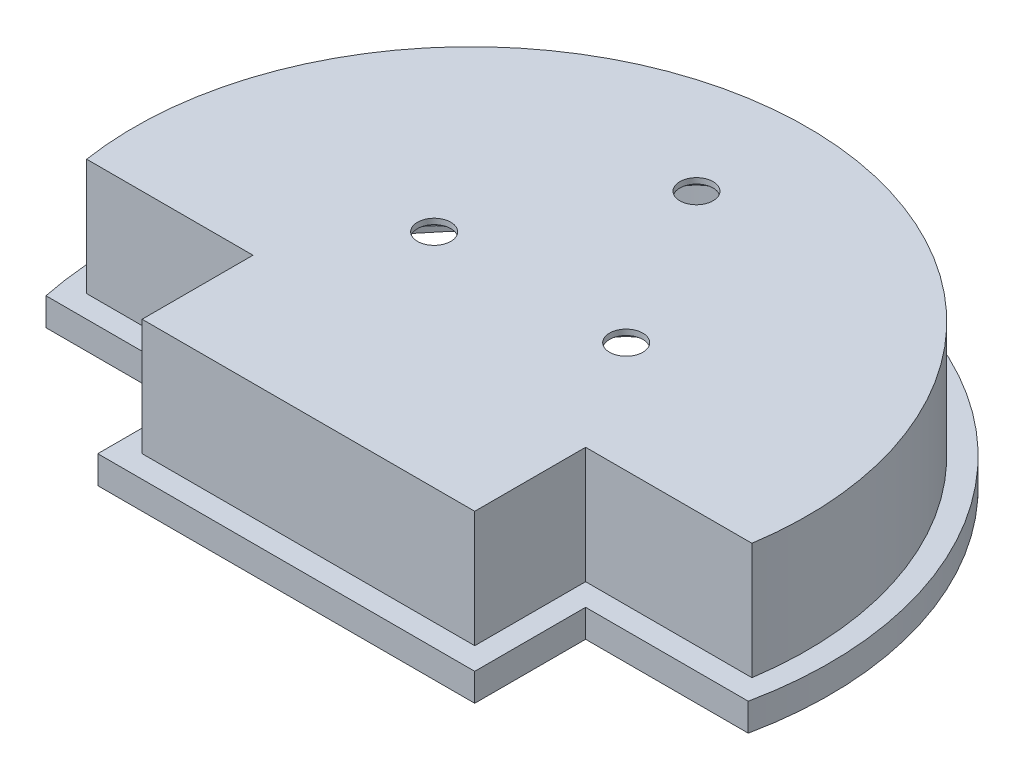
ISO-10303-21;
HEADER;
FILE_DESCRIPTION(('STEP AP214'),'2;1');
FILE_NAME('part.step','',(''),(''),'','','');
FILE_SCHEMA(('AUTOMOTIVE_DESIGN { 1 0 10303 214 1 1 1 1 }'));
ENDSEC;
DATA;
#1=APPLICATION_CONTEXT('core data for automotive mechanical design processes');
#2=APPLICATION_PROTOCOL_DEFINITION('international standard','automotive_design',2000,#1);
#3=PRODUCT_CONTEXT('',#1,'mechanical');
#4=PRODUCT('Part','Part','',(#3));
#5=PRODUCT_RELATED_PRODUCT_CATEGORY('part','',(#4));
#6=PRODUCT_DEFINITION_FORMATION('','',#4);
#7=PRODUCT_DEFINITION_CONTEXT('part definition',#1,'design');
#8=PRODUCT_DEFINITION('design','',#6,#7);
#9=PRODUCT_DEFINITION_SHAPE('','',#8);
#10=(LENGTH_UNIT() NAMED_UNIT(*) SI_UNIT(.MILLI.,.METRE.));
#11=(NAMED_UNIT(*) PLANE_ANGLE_UNIT() SI_UNIT($,.RADIAN.));
#12=(NAMED_UNIT(*) SI_UNIT($,.STERADIAN.) SOLID_ANGLE_UNIT());
#13=UNCERTAINTY_MEASURE_WITH_UNIT(LENGTH_MEASURE(1.E-05),#10,'distance_accuracy_value','');
#14=(GEOMETRIC_REPRESENTATION_CONTEXT(3) GLOBAL_UNCERTAINTY_ASSIGNED_CONTEXT((#13)) GLOBAL_UNIT_ASSIGNED_CONTEXT((#10,
#11,#12)) REPRESENTATION_CONTEXT('',''));
#15=CARTESIAN_POINT('',(0.,0.,0.));
#16=DIRECTION('',(0.,0.,1.));
#17=DIRECTION('',(1.,0.,0.));
#18=AXIS2_PLACEMENT_3D('',#15,#16,#17);
#19=CARTESIAN_POINT('',(0.,0.,-14.6428571428571));
#20=DIRECTION('',(0.,1.,0.));
#21=DIRECTION('',(0.,0.,1.));
#22=AXIS2_PLACEMENT_3D('',#19,#20,#21);
#23=PLANE('',#22);
#24=DIRECTION('',(0.,0.,1.));
#25=VECTOR('',#24,1.);
#26=CARTESIAN_POINT('',(-13.,0.,-14.6428571428571));
#27=LINE('',#26,#25);
#28=CARTESIAN_POINT('',(-13.,0.,-12.));
#29=VERTEX_POINT('',#28);
#30=CARTESIAN_POINT('',(-13.,0.,-2.));
#31=VERTEX_POINT('',#30);
#32=EDGE_CURVE('E356',#29,#31,#27,.T.);
#33=ORIENTED_EDGE('',*,*,#32,.T.);
#34=DIRECTION('',(1.,0.,0.));
#35=VECTOR('',#34,1.);
#36=CARTESIAN_POINT('',(0.,0.,-2.));
#37=LINE('',#36,#35);
#38=CARTESIAN_POINT('',(13.,0.,-2.));
#39=VERTEX_POINT('',#38);
#40=EDGE_CURVE('E386',#31,#39,#37,.T.);
#41=ORIENTED_EDGE('',*,*,#40,.T.);
#42=DIRECTION('',(0.,0.,-1.));
#43=VECTOR('',#42,1.);
#44=CARTESIAN_POINT('',(13.,0.,-14.6428571428571));
#45=LINE('',#44,#43);
#46=CARTESIAN_POINT('',(13.,0.,-12.));
#47=VERTEX_POINT('',#46);
#48=EDGE_CURVE('E390',#39,#47,#45,.T.);
#49=ORIENTED_EDGE('',*,*,#48,.T.);
#50=DIRECTION('',(1.,0.,0.));
#51=VECTOR('',#50,1.);
#52=CARTESIAN_POINT('',(0.,0.,-12.));
#53=LINE('',#52,#51);
#54=CARTESIAN_POINT('',(28.2337184434296,0.,-12.));
#55=VERTEX_POINT('',#54);
#56=EDGE_CURVE('E394',#47,#55,#53,.T.);
#57=ORIENTED_EDGE('',*,*,#56,.T.);
#58=CARTESIAN_POINT('',(0.,0.,-14.6428571428571));
#59=DIRECTION('',(0.,-1.,0.));
#60=DIRECTION('',(-1.,0.,0.));
#61=AXIS2_PLACEMENT_3D('',#58,#59,#60);
#62=CIRCLE('',#61,28.3571428571429);
#63=CARTESIAN_POINT('',(-28.2337184434296,0.,-12.));
#64=VERTEX_POINT('',#63);
#65=EDGE_CURVE('E398',#55,#64,#62,.F.);
#66=ORIENTED_EDGE('',*,*,#65,.T.);
#67=DIRECTION('',(1.,0.,0.));
#68=VECTOR('',#67,1.);
#69=CARTESIAN_POINT('',(0.,0.,-12.));
#70=LINE('',#69,#68);
#71=EDGE_CURVE('E362',#64,#29,#70,.T.);
#72=ORIENTED_EDGE('',*,*,#71,.T.);
#73=EDGE_LOOP('',(#33,#41,#49,#57,#66,#72));
#74=FACE_BOUND('',#73,.T.);
#75=DIRECTION('',(0.,0.,1.));
#76=VECTOR('',#75,1.);
#77=CARTESIAN_POINT('',(17.,0.,-8.00000000000001));
#78=LINE('',#77,#76);
#79=CARTESIAN_POINT('',(17.,0.,-8.00000000000001));
#80=VERTEX_POINT('',#79);
#81=CARTESIAN_POINT('',(17.,0.,2.));
#82=VERTEX_POINT('',#81);
#83=EDGE_CURVE('E259',#80,#82,#78,.T.);
#84=ORIENTED_EDGE('',*,*,#83,.T.);
#85=DIRECTION('',(-1.,0.,0.));
#86=VECTOR('',#85,1.);
#87=CARTESIAN_POINT('',(17.,0.,2.));
#88=LINE('',#87,#86);
#89=CARTESIAN_POINT('',(-17.,0.,2.));
#90=VERTEX_POINT('',#89);
#91=EDGE_CURVE('E212',#82,#90,#88,.T.);
#92=ORIENTED_EDGE('',*,*,#91,.T.);
#93=DIRECTION('',(0.,0.,-1.));
#94=VECTOR('',#93,1.);
#95=CARTESIAN_POINT('',(-17.,0.,2.));
#96=LINE('',#95,#94);
#97=CARTESIAN_POINT('',(-17.,0.,-8.));
#98=VERTEX_POINT('',#97);
#99=EDGE_CURVE('E264',#90,#98,#96,.T.);
#100=ORIENTED_EDGE('',*,*,#99,.T.);
#101=DIRECTION('',(-1.,0.,0.));
#102=VECTOR('',#101,1.);
#103=CARTESIAN_POINT('',(-17.,0.,-8.));
#104=LINE('',#103,#102);
#105=CARTESIAN_POINT('',(-31.6679197747049,0.,-8.));
#106=VERTEX_POINT('',#105);
#107=EDGE_CURVE('E268',#98,#106,#104,.T.);
#108=ORIENTED_EDGE('',*,*,#107,.T.);
#109=CARTESIAN_POINT('',(0.,0.,-14.6428571428571));
#110=DIRECTION('',(0.,-1.,0.));
#111=DIRECTION('',(0.,0.,-1.));
#112=AXIS2_PLACEMENT_3D('',#109,#110,#111);
#113=CIRCLE('',#112,32.3571428571429);
#114=CARTESIAN_POINT('',(31.6679197747049,0.,-8.00000000000001));
#115=VERTEX_POINT('',#114);
#116=EDGE_CURVE('E241',#106,#115,#113,.T.);
#117=ORIENTED_EDGE('',*,*,#116,.T.);
#118=DIRECTION('',(-1.,0.,0.));
#119=VECTOR('',#118,1.);
#120=CARTESIAN_POINT('',(31.6679197747049,0.,-8.00000000000001));
#121=LINE('',#120,#119);
#122=EDGE_CURVE('E237',#115,#80,#121,.T.);
#123=ORIENTED_EDGE('',*,*,#122,.T.);
#124=EDGE_LOOP('',(#84,#92,#100,#108,#117,#123));
#125=FACE_BOUND('',#124,.T.);
#126=ADVANCED_FACE('F79',(#74,#125),#23,.F.);
#127=CARTESIAN_POINT('',(-13.,11.,-14.6428571428571));
#128=DIRECTION('',(1.,0.,0.));
#129=DIRECTION('',(0.,0.,-1.));
#130=AXIS2_PLACEMENT_3D('',#127,#128,#129);
#131=PLANE('',#130);
#132=ORIENTED_EDGE('',*,*,#32,.F.);
#133=DIRECTION('',(0.,-1.,0.));
#134=VECTOR('',#133,1.);
#135=CARTESIAN_POINT('',(-13.,11.,-12.));
#136=LINE('',#135,#134);
#137=CARTESIAN_POINT('',(-13.,11.,-12.));
#138=VERTEX_POINT('',#137);
#139=EDGE_CURVE('E382',#138,#29,#136,.T.);
#140=ORIENTED_EDGE('',*,*,#139,.F.);
#141=DIRECTION('',(0.,0.,1.));
#142=VECTOR('',#141,1.);
#143=CARTESIAN_POINT('',(-13.,11.,-14.6428571428571));
#144=LINE('',#143,#142);
#145=CARTESIAN_POINT('',(-13.,11.,-2.));
#146=VERTEX_POINT('',#145);
#147=EDGE_CURVE('E357',#138,#146,#144,.T.);
#148=ORIENTED_EDGE('',*,*,#147,.T.);
#149=DIRECTION('',(0.,-1.,0.));
#150=VECTOR('',#149,1.);
#151=CARTESIAN_POINT('',(-13.,11.,-2.));
#152=LINE('',#151,#150);
#153=EDGE_CURVE('E419',#146,#31,#152,.T.);
#154=ORIENTED_EDGE('',*,*,#153,.T.);
#155=EDGE_LOOP('',(#132,#140,#148,#154));
#156=FACE_BOUND('',#155,.T.);
#157=ADVANCED_FACE('F483',(#156),#131,.T.);
#158=CARTESIAN_POINT('',(0.,11.,-2.));
#159=DIRECTION('',(0.,0.,-1.));
#160=DIRECTION('',(-1.,0.,0.));
#161=AXIS2_PLACEMENT_3D('',#158,#159,#160);
#162=PLANE('',#161);
#163=ORIENTED_EDGE('',*,*,#40,.F.);
#164=ORIENTED_EDGE('',*,*,#153,.F.);
#165=DIRECTION('',(1.,0.,0.));
#166=VECTOR('',#165,1.);
#167=CARTESIAN_POINT('',(0.,11.,-2.));
#168=LINE('',#167,#166);
#169=CARTESIAN_POINT('',(13.,11.,-2.));
#170=VERTEX_POINT('',#169);
#171=EDGE_CURVE('E361',#146,#170,#168,.T.);
#172=ORIENTED_EDGE('',*,*,#171,.T.);
#173=DIRECTION('',(0.,-1.,0.));
#174=VECTOR('',#173,1.);
#175=CARTESIAN_POINT('',(13.,11.,-2.));
#176=LINE('',#175,#174);
#177=EDGE_CURVE('E416',#170,#39,#176,.T.);
#178=ORIENTED_EDGE('',*,*,#177,.T.);
#179=EDGE_LOOP('',(#163,#164,#172,#178));
#180=FACE_BOUND('',#179,.T.);
#181=ADVANCED_FACE('F485',(#180),#162,.T.);
#182=CARTESIAN_POINT('',(13.,11.,-14.6428571428571));
#183=DIRECTION('',(-1.,0.,0.));
#184=DIRECTION('',(0.,0.,1.));
#185=AXIS2_PLACEMENT_3D('',#182,#183,#184);
#186=PLANE('',#185);
#187=ORIENTED_EDGE('',*,*,#48,.F.);
#188=ORIENTED_EDGE('',*,*,#177,.F.);
#189=DIRECTION('',(0.,0.,-1.));
#190=VECTOR('',#189,1.);
#191=CARTESIAN_POINT('',(13.,11.,-14.6428571428571));
#192=LINE('',#191,#190);
#193=CARTESIAN_POINT('',(13.,11.,-12.));
#194=VERTEX_POINT('',#193);
#195=EDGE_CURVE('E366',#170,#194,#192,.T.);
#196=ORIENTED_EDGE('',*,*,#195,.T.);
#197=DIRECTION('',(0.,-1.,0.));
#198=VECTOR('',#197,1.);
#199=CARTESIAN_POINT('',(13.,11.,-12.));
#200=LINE('',#199,#198);
#201=EDGE_CURVE('E413',#194,#47,#200,.T.);
#202=ORIENTED_EDGE('',*,*,#201,.T.);
#203=EDGE_LOOP('',(#187,#188,#196,#202));
#204=FACE_BOUND('',#203,.T.);
#205=ADVANCED_FACE('F501',(#204),#186,.T.);
#206=CARTESIAN_POINT('',(0.,11.,-12.));
#207=DIRECTION('',(0.,0.,-1.));
#208=DIRECTION('',(-1.,0.,0.));
#209=AXIS2_PLACEMENT_3D('',#206,#207,#208);
#210=PLANE('',#209);
#211=ORIENTED_EDGE('',*,*,#56,.F.);
#212=ORIENTED_EDGE('',*,*,#201,.F.);
#213=DIRECTION('',(1.,0.,0.));
#214=VECTOR('',#213,1.);
#215=CARTESIAN_POINT('',(0.,11.,-12.));
#216=LINE('',#215,#214);
#217=CARTESIAN_POINT('',(28.2337184434296,11.,-12.));
#218=VERTEX_POINT('',#217);
#219=EDGE_CURVE('E370',#194,#218,#216,.T.);
#220=ORIENTED_EDGE('',*,*,#219,.T.);
#221=DIRECTION('',(0.,-1.,0.));
#222=VECTOR('',#221,1.);
#223=CARTESIAN_POINT('',(28.2337184434296,11.,-12.));
#224=LINE('',#223,#222);
#225=EDGE_CURVE('E410',#218,#55,#224,.T.);
#226=ORIENTED_EDGE('',*,*,#225,.T.);
#227=EDGE_LOOP('',(#211,#212,#220,#226));
#228=FACE_BOUND('',#227,.T.);
#229=ADVANCED_FACE('F498',(#228),#210,.T.);
#230=CARTESIAN_POINT('',(0.,11.,-14.6428571428571));
#231=DIRECTION('',(0.,-1.,0.));
#232=DIRECTION('',(0.,0.,-1.));
#233=AXIS2_PLACEMENT_3D('',#230,#231,#232);
#234=CYLINDRICAL_SURFACE('',#233,28.3571428571429);
#235=ORIENTED_EDGE('',*,*,#65,.F.);
#236=ORIENTED_EDGE('',*,*,#225,.F.);
#237=CARTESIAN_POINT('',(0.,11.,-14.6428571428571));
#238=DIRECTION('',(0.,-1.,0.));
#239=DIRECTION('',(-1.,0.,0.));
#240=AXIS2_PLACEMENT_3D('',#237,#238,#239);
#241=CIRCLE('',#240,28.3571428571429);
#242=CARTESIAN_POINT('',(-28.2337184434296,11.,-12.));
#243=VERTEX_POINT('',#242);
#244=EDGE_CURVE('E374',#218,#243,#241,.F.);
#245=ORIENTED_EDGE('',*,*,#244,.T.);
#246=DIRECTION('',(0.,-1.,0.));
#247=VECTOR('',#246,1.);
#248=CARTESIAN_POINT('',(-28.2337184434296,11.,-12.));
#249=LINE('',#248,#247);
#250=EDGE_CURVE('E407',#243,#64,#249,.T.);
#251=ORIENTED_EDGE('',*,*,#250,.T.);
#252=EDGE_LOOP('',(#235,#236,#245,#251));
#253=FACE_BOUND('',#252,.T.);
#254=ADVANCED_FACE('F499',(#253),#234,.F.);
#255=CARTESIAN_POINT('',(0.,11.,-12.));
#256=DIRECTION('',(0.,0.,-1.));
#257=DIRECTION('',(-1.,0.,0.));
#258=AXIS2_PLACEMENT_3D('',#255,#256,#257);
#259=PLANE('',#258);
#260=ORIENTED_EDGE('',*,*,#71,.F.);
#261=ORIENTED_EDGE('',*,*,#250,.F.);
#262=DIRECTION('',(1.,0.,0.));
#263=VECTOR('',#262,1.);
#264=CARTESIAN_POINT('',(0.,11.,-12.));
#265=LINE('',#264,#263);
#266=EDGE_CURVE('E378',#243,#138,#265,.T.);
#267=ORIENTED_EDGE('',*,*,#266,.T.);
#268=ORIENTED_EDGE('',*,*,#139,.T.);
#269=EDGE_LOOP('',(#260,#261,#267,#268));
#270=FACE_BOUND('',#269,.T.);
#271=ADVANCED_FACE('F474',(#270),#259,.T.);
#272=CARTESIAN_POINT('',(0.,11.,-14.6428571428571));
#273=DIRECTION('',(0.,1.,0.));
#274=DIRECTION('',(0.,0.,1.));
#275=AXIS2_PLACEMENT_3D('',#272,#273,#274);
#276=PLANE('',#275);
#277=CARTESIAN_POINT('',(-8.66025403784439,11.,-20.));
#278=DIRECTION('',(0.,-1.,0.));
#279=DIRECTION('',(0.,0.,-1.));
#280=AXIS2_PLACEMENT_3D('',#277,#278,#279);
#281=CIRCLE('',#280,3.5);
#282=CARTESIAN_POINT('',(-8.66025403784439,11.,-23.5));
#283=VERTEX_POINT('',#282);
#284=EDGE_CURVE('E314',#283,#283,#281,.T.);
#285=ORIENTED_EDGE('',*,*,#284,.F.);
#286=EDGE_LOOP('',(#285));
#287=FACE_BOUND('',#286,.T.);
#288=CARTESIAN_POINT('',(8.66025403784439,11.,-20.));
#289=DIRECTION('',(0.,-1.,0.));
#290=DIRECTION('',(0.,0.,-1.));
#291=AXIS2_PLACEMENT_3D('',#288,#289,#290);
#292=CIRCLE('',#291,3.5);
#293=CARTESIAN_POINT('',(8.66025403784439,11.,-23.5));
#294=VERTEX_POINT('',#293);
#295=EDGE_CURVE('E318',#294,#294,#292,.T.);
#296=ORIENTED_EDGE('',*,*,#295,.F.);
#297=EDGE_LOOP('',(#296));
#298=FACE_BOUND('',#297,.T.);
#299=CARTESIAN_POINT('',(0.,11.,-35.));
#300=DIRECTION('',(0.,-1.,0.));
#301=DIRECTION('',(0.,0.,-1.));
#302=AXIS2_PLACEMENT_3D('',#299,#300,#301);
#303=CIRCLE('',#302,3.5);
#304=CARTESIAN_POINT('',(0.,11.,-38.5));
#305=VERTEX_POINT('',#304);
#306=EDGE_CURVE('E326',#305,#305,#303,.T.);
#307=ORIENTED_EDGE('',*,*,#306,.F.);
#308=EDGE_LOOP('',(#307));
#309=FACE_BOUND('',#308,.T.);
#310=ORIENTED_EDGE('',*,*,#171,.F.);
#311=ORIENTED_EDGE('',*,*,#147,.F.);
#312=ORIENTED_EDGE('',*,*,#266,.F.);
#313=ORIENTED_EDGE('',*,*,#244,.F.);
#314=ORIENTED_EDGE('',*,*,#219,.F.);
#315=ORIENTED_EDGE('',*,*,#195,.F.);
#316=EDGE_LOOP('',(#310,#311,#312,#313,#314,#315));
#317=FACE_BOUND('',#316,.T.);
#318=ADVANCED_FACE('F468',(#287,#298,#309,#317),#276,.F.);
#319=CARTESIAN_POINT('',(0.,12.5,-35.));
#320=DIRECTION('',(0.,-1.,0.));
#321=DIRECTION('',(0.,0.,-1.));
#322=AXIS2_PLACEMENT_3D('',#319,#320,#321);
#323=CYLINDRICAL_SURFACE('',#322,3.5);
#324=CARTESIAN_POINT('',(0.,12.5,-35.));
#325=DIRECTION('',(0.,-1.,0.));
#326=DIRECTION('',(0.,0.,-1.));
#327=AXIS2_PLACEMENT_3D('',#324,#325,#326);
#328=CIRCLE('',#327,3.5);
#329=CARTESIAN_POINT('',(0.,12.5,-38.5));
#330=VERTEX_POINT('',#329);
#331=EDGE_CURVE('E308',#330,#330,#328,.T.);
#332=ORIENTED_EDGE('',*,*,#331,.F.);
#333=EDGE_LOOP('',(#332));
#334=FACE_BOUND('',#333,.T.);
#335=ORIENTED_EDGE('',*,*,#306,.T.);
#336=EDGE_LOOP('',(#335));
#337=FACE_BOUND('',#336,.T.);
#338=ADVANCED_FACE('F462',(#334,#337),#323,.F.);
#339=CARTESIAN_POINT('',(0.,12.5,-35.));
#340=DIRECTION('',(0.,-1.,0.));
#341=DIRECTION('',(0.,0.,-1.));
#342=AXIS2_PLACEMENT_3D('',#339,#340,#341);
#343=PLANE('',#342);
#344=CARTESIAN_POINT('',(0.,12.5,-35.));
#345=DIRECTION('',(0.,-1.,0.));
#346=DIRECTION('',(0.,0.,-1.));
#347=AXIS2_PLACEMENT_3D('',#344,#345,#346);
#348=CIRCLE('',#347,1.5);
#349=CARTESIAN_POINT('',(0.,12.5,-36.5));
#350=VERTEX_POINT('',#349);
#351=EDGE_CURVE('E441',#350,#350,#348,.T.);
#352=ORIENTED_EDGE('',*,*,#351,.F.);
#353=EDGE_LOOP('',(#352));
#354=FACE_BOUND('',#353,.T.);
#355=ORIENTED_EDGE('',*,*,#331,.T.);
#356=EDGE_LOOP('',(#355));
#357=FACE_BOUND('',#356,.T.);
#358=ADVANCED_FACE('F458',(#354,#357),#343,.T.);
#359=CARTESIAN_POINT('',(8.66025403784439,12.5,-20.));
#360=DIRECTION('',(0.,-1.,0.));
#361=DIRECTION('',(0.,0.,-1.));
#362=AXIS2_PLACEMENT_3D('',#359,#360,#361);
#363=CYLINDRICAL_SURFACE('',#362,3.5);
#364=CARTESIAN_POINT('',(8.66025403784439,12.5,-20.));
#365=DIRECTION('',(0.,-1.,0.));
#366=DIRECTION('',(0.,0.,-1.));
#367=AXIS2_PLACEMENT_3D('',#364,#365,#366);
#368=CIRCLE('',#367,3.5);
#369=CARTESIAN_POINT('',(8.66025403784439,12.5,-23.5));
#370=VERTEX_POINT('',#369);
#371=EDGE_CURVE('E322',#370,#370,#368,.T.);
#372=ORIENTED_EDGE('',*,*,#371,.F.);
#373=EDGE_LOOP('',(#372));
#374=FACE_BOUND('',#373,.T.);
#375=ORIENTED_EDGE('',*,*,#295,.T.);
#376=EDGE_LOOP('',(#375));
#377=FACE_BOUND('',#376,.T.);
#378=ADVANCED_FACE('F461',(#374,#377),#363,.F.);
#379=CARTESIAN_POINT('',(8.66025403784439,12.5,-20.));
#380=DIRECTION('',(0.,-1.,0.));
#381=DIRECTION('',(0.,0.,-1.));
#382=AXIS2_PLACEMENT_3D('',#379,#380,#381);
#383=PLANE('',#382);
#384=CARTESIAN_POINT('',(8.66025403784439,12.5,-20.));
#385=DIRECTION('',(0.,-1.,0.));
#386=DIRECTION('',(0.,0.,-1.));
#387=AXIS2_PLACEMENT_3D('',#384,#385,#386);
#388=CIRCLE('',#387,1.5);
#389=CARTESIAN_POINT('',(8.66025403784439,12.5,-21.5));
#390=VERTEX_POINT('',#389);
#391=EDGE_CURVE('E445',#390,#390,#388,.T.);
#392=ORIENTED_EDGE('',*,*,#391,.F.);
#393=EDGE_LOOP('',(#392));
#394=FACE_BOUND('',#393,.T.);
#395=ORIENTED_EDGE('',*,*,#371,.T.);
#396=EDGE_LOOP('',(#395));
#397=FACE_BOUND('',#396,.T.);
#398=ADVANCED_FACE('F580',(#394,#397),#383,.T.);
#399=CARTESIAN_POINT('',(-8.66025403784439,12.5,-20.));
#400=DIRECTION('',(0.,-1.,0.));
#401=DIRECTION('',(0.,0.,-1.));
#402=AXIS2_PLACEMENT_3D('',#399,#400,#401);
#403=CYLINDRICAL_SURFACE('',#402,3.5);
#404=CARTESIAN_POINT('',(-8.66025403784439,12.5,-20.));
#405=DIRECTION('',(0.,-1.,0.));
#406=DIRECTION('',(0.,0.,-1.));
#407=AXIS2_PLACEMENT_3D('',#404,#405,#406);
#408=CIRCLE('',#407,3.5);
#409=CARTESIAN_POINT('',(-8.66025403784439,12.5,-23.5));
#410=VERTEX_POINT('',#409);
#411=EDGE_CURVE('E309',#410,#410,#408,.T.);
#412=ORIENTED_EDGE('',*,*,#411,.F.);
#413=EDGE_LOOP('',(#412));
#414=FACE_BOUND('',#413,.T.);
#415=ORIENTED_EDGE('',*,*,#284,.T.);
#416=EDGE_LOOP('',(#415));
#417=FACE_BOUND('',#416,.T.);
#418=ADVANCED_FACE('F576',(#414,#417),#403,.F.);
#419=CARTESIAN_POINT('',(-8.66025403784439,12.5,-20.));
#420=DIRECTION('',(0.,-1.,0.));
#421=DIRECTION('',(0.,0.,-1.));
#422=AXIS2_PLACEMENT_3D('',#419,#420,#421);
#423=PLANE('',#422);
#424=CARTESIAN_POINT('',(-8.66025403784439,12.5,-20.));
#425=DIRECTION('',(0.,-1.,0.));
#426=DIRECTION('',(0.,0.,-1.));
#427=AXIS2_PLACEMENT_3D('',#424,#425,#426);
#428=CIRCLE('',#427,1.5);
#429=CARTESIAN_POINT('',(-8.66025403784439,12.5,-21.5));
#430=VERTEX_POINT('',#429);
#431=EDGE_CURVE('E244',#430,#430,#428,.T.);
#432=ORIENTED_EDGE('',*,*,#431,.F.);
#433=EDGE_LOOP('',(#432));
#434=FACE_BOUND('',#433,.T.);
#435=ORIENTED_EDGE('',*,*,#411,.T.);
#436=EDGE_LOOP('',(#435));
#437=FACE_BOUND('',#436,.T.);
#438=ADVANCED_FACE('F553',(#434,#437),#423,.T.);
#439=CARTESIAN_POINT('',(0.,2.5,-14.6428571428571));
#440=DIRECTION('',(0.,-1.,0.));
#441=DIRECTION('',(0.,0.,-1.));
#442=AXIS2_PLACEMENT_3D('',#439,#440,#441);
#443=PLANE('',#442);
#444=DIRECTION('',(0.,0.,1.));
#445=VECTOR('',#444,1.);
#446=CARTESIAN_POINT('',(17.,2.5,-8.00000000000001));
#447=LINE('',#446,#445);
#448=CARTESIAN_POINT('',(17.,2.5,-8.00000000000001));
#449=VERTEX_POINT('',#448);
#450=CARTESIAN_POINT('',(17.,2.5,2.));
#451=VERTEX_POINT('',#450);
#452=EDGE_CURVE('E227',#449,#451,#447,.T.);
#453=ORIENTED_EDGE('',*,*,#452,.F.);
#454=DIRECTION('',(-1.,0.,0.));
#455=VECTOR('',#454,1.);
#456=CARTESIAN_POINT('',(31.6679197747049,2.5,-8.00000000000001));
#457=LINE('',#456,#455);
#458=CARTESIAN_POINT('',(31.6679197747049,2.5,-8.00000000000001));
#459=VERTEX_POINT('',#458);
#460=EDGE_CURVE('E219',#459,#449,#457,.T.);
#461=ORIENTED_EDGE('',*,*,#460,.F.);
#462=CARTESIAN_POINT('',(0.,2.5,-14.6428571428571));
#463=DIRECTION('',(0.,-1.,0.));
#464=DIRECTION('',(0.,0.,-1.));
#465=AXIS2_PLACEMENT_3D('',#462,#463,#464);
#466=CIRCLE('',#465,32.3571428571429);
#467=CARTESIAN_POINT('',(-31.6679197747049,2.5,-8.));
#468=VERTEX_POINT('',#467);
#469=EDGE_CURVE('E253',#468,#459,#466,.T.);
#470=ORIENTED_EDGE('',*,*,#469,.F.);
#471=DIRECTION('',(-1.,0.,0.));
#472=VECTOR('',#471,1.);
#473=CARTESIAN_POINT('',(-17.,2.5,-8.));
#474=LINE('',#473,#472);
#475=CARTESIAN_POINT('',(-17.,2.5,-8.));
#476=VERTEX_POINT('',#475);
#477=EDGE_CURVE('E249',#476,#468,#474,.T.);
#478=ORIENTED_EDGE('',*,*,#477,.F.);
#479=DIRECTION('',(0.,0.,-1.));
#480=VECTOR('',#479,1.);
#481=CARTESIAN_POINT('',(-17.,2.5,2.));
#482=LINE('',#481,#480);
#483=CARTESIAN_POINT('',(-17.,2.5,2.));
#484=VERTEX_POINT('',#483);
#485=EDGE_CURVE('E231',#484,#476,#482,.T.);
#486=ORIENTED_EDGE('',*,*,#485,.F.);
#487=DIRECTION('',(-1.,0.,0.));
#488=VECTOR('',#487,1.);
#489=CARTESIAN_POINT('',(17.,2.5,2.));
#490=LINE('',#489,#488);
#491=EDGE_CURVE('E210',#451,#484,#490,.T.);
#492=ORIENTED_EDGE('',*,*,#491,.F.);
#493=EDGE_LOOP('',(#453,#461,#470,#478,#486,#492));
#494=FACE_BOUND('',#493,.T.);
#495=DIRECTION('',(-1.,0.,0.));
#496=VECTOR('',#495,1.);
#497=CARTESIAN_POINT('',(-15.,2.5,0.));
#498=LINE('',#497,#496);
#499=CARTESIAN_POINT('',(15.,2.5,0.));
#500=VERTEX_POINT('',#499);
#501=CARTESIAN_POINT('',(-15.,2.5,0.));
#502=VERTEX_POINT('',#501);
#503=EDGE_CURVE('E103',#500,#502,#498,.T.);
#504=ORIENTED_EDGE('',*,*,#503,.T.);
#505=DIRECTION('',(0.,0.,-1.));
#506=VECTOR('',#505,1.);
#507=CARTESIAN_POINT('',(-15.,2.5,0.));
#508=LINE('',#507,#506);
#509=CARTESIAN_POINT('',(-15.,2.5,-10.));
#510=VERTEX_POINT('',#509);
#511=EDGE_CURVE('E97',#502,#510,#508,.T.);
#512=ORIENTED_EDGE('',*,*,#511,.T.);
#513=DIRECTION('',(-1.,0.,0.));
#514=VECTOR('',#513,1.);
#515=CARTESIAN_POINT('',(-15.,2.5,-10.));
#516=LINE('',#515,#514);
#517=CARTESIAN_POINT('',(-30.,2.5,-10.));
#518=VERTEX_POINT('',#517);
#519=EDGE_CURVE('E277',#510,#518,#516,.T.);
#520=ORIENTED_EDGE('',*,*,#519,.T.);
#521=CARTESIAN_POINT('',(0.,2.5,-14.6428571428571));
#522=DIRECTION('',(0.,-1.,0.));
#523=DIRECTION('',(0.,0.,-1.));
#524=AXIS2_PLACEMENT_3D('',#521,#522,#523);
#525=CIRCLE('',#524,30.3571428571429);
#526=CARTESIAN_POINT('',(30.,2.5,-10.));
#527=VERTEX_POINT('',#526);
#528=EDGE_CURVE('E292',#518,#527,#525,.T.);
#529=ORIENTED_EDGE('',*,*,#528,.T.);
#530=DIRECTION('',(-1.,0.,0.));
#531=VECTOR('',#530,1.);
#532=CARTESIAN_POINT('',(15.,2.5,-10.));
#533=LINE('',#532,#531);
#534=CARTESIAN_POINT('',(15.,2.5,-10.));
#535=VERTEX_POINT('',#534);
#536=EDGE_CURVE('E296',#527,#535,#533,.T.);
#537=ORIENTED_EDGE('',*,*,#536,.T.);
#538=DIRECTION('',(0.,0.,1.));
#539=VECTOR('',#538,1.);
#540=CARTESIAN_POINT('',(15.,2.5,0.));
#541=LINE('',#540,#539);
#542=EDGE_CURVE('E300',#535,#500,#541,.T.);
#543=ORIENTED_EDGE('',*,*,#542,.T.);
#544=EDGE_LOOP('',(#504,#512,#520,#529,#537,#543));
#545=FACE_BOUND('',#544,.T.);
#546=ADVANCED_FACE('F224',(#494,#545),#443,.F.);
#547=CARTESIAN_POINT('',(17.,2.5,-8.00000000000001));
#548=DIRECTION('',(1.,0.,0.));
#549=DIRECTION('',(0.,0.,-1.));
#550=AXIS2_PLACEMENT_3D('',#547,#548,#549);
#551=PLANE('',#550);
#552=ORIENTED_EDGE('',*,*,#83,.F.);
#553=DIRECTION('',(0.,-1.,0.));
#554=VECTOR('',#553,1.);
#555=CARTESIAN_POINT('',(17.,2.5,-8.00000000000001));
#556=LINE('',#555,#554);
#557=EDGE_CURVE('E235',#449,#80,#556,.T.);
#558=ORIENTED_EDGE('',*,*,#557,.F.);
#559=ORIENTED_EDGE('',*,*,#452,.T.);
#560=DIRECTION('',(0.,-1.,0.));
#561=VECTOR('',#560,1.);
#562=CARTESIAN_POINT('',(17.,2.5,2.));
#563=LINE('',#562,#561);
#564=EDGE_CURVE('E207',#451,#82,#563,.T.);
#565=ORIENTED_EDGE('',*,*,#564,.T.);
#566=EDGE_LOOP('',(#552,#558,#559,#565));
#567=FACE_BOUND('',#566,.T.);
#568=ADVANCED_FACE('F234',(#567),#551,.T.);
#569=CARTESIAN_POINT('',(31.6679197747049,2.5,-8.00000000000001));
#570=DIRECTION('',(0.,0.,1.));
#571=DIRECTION('',(1.,0.,0.));
#572=AXIS2_PLACEMENT_3D('',#569,#570,#571);
#573=PLANE('',#572);
#574=ORIENTED_EDGE('',*,*,#122,.F.);
#575=DIRECTION('',(0.,-1.,0.));
#576=VECTOR('',#575,1.);
#577=CARTESIAN_POINT('',(31.6679197747049,2.5,-8.00000000000001));
#578=LINE('',#577,#576);
#579=EDGE_CURVE('E278',#459,#115,#578,.T.);
#580=ORIENTED_EDGE('',*,*,#579,.F.);
#581=ORIENTED_EDGE('',*,*,#460,.T.);
#582=ORIENTED_EDGE('',*,*,#557,.T.);
#583=EDGE_LOOP('',(#574,#580,#581,#582));
#584=FACE_BOUND('',#583,.T.);
#585=ADVANCED_FACE('F554',(#584),#573,.T.);
#586=CARTESIAN_POINT('',(0.,2.5,-14.6428571428571));
#587=DIRECTION('',(0.,-1.,0.));
#588=DIRECTION('',(0.,0.,-1.));
#589=AXIS2_PLACEMENT_3D('',#586,#587,#588);
#590=CYLINDRICAL_SURFACE('',#589,32.3571428571429);
#591=ORIENTED_EDGE('',*,*,#116,.F.);
#592=DIRECTION('',(0.,-1.,0.));
#593=VECTOR('',#592,1.);
#594=CARTESIAN_POINT('',(-31.6679197747049,2.5,-8.));
#595=LINE('',#594,#593);
#596=EDGE_CURVE('E281',#468,#106,#595,.T.);
#597=ORIENTED_EDGE('',*,*,#596,.F.);
#598=ORIENTED_EDGE('',*,*,#469,.T.);
#599=ORIENTED_EDGE('',*,*,#579,.T.);
#600=EDGE_LOOP('',(#591,#597,#598,#599));
#601=FACE_BOUND('',#600,.T.);
#602=ADVANCED_FACE('F557',(#601),#590,.T.);
#603=CARTESIAN_POINT('',(-17.,2.5,-8.));
#604=DIRECTION('',(0.,0.,1.));
#605=DIRECTION('',(1.,0.,0.));
#606=AXIS2_PLACEMENT_3D('',#603,#604,#605);
#607=PLANE('',#606);
#608=ORIENTED_EDGE('',*,*,#107,.F.);
#609=DIRECTION('',(0.,-1.,0.));
#610=VECTOR('',#609,1.);
#611=CARTESIAN_POINT('',(-17.,2.5,-8.));
#612=LINE('',#611,#610);
#613=EDGE_CURVE('E284',#476,#98,#612,.T.);
#614=ORIENTED_EDGE('',*,*,#613,.F.);
#615=ORIENTED_EDGE('',*,*,#477,.T.);
#616=ORIENTED_EDGE('',*,*,#596,.T.);
#617=EDGE_LOOP('',(#608,#614,#615,#616));
#618=FACE_BOUND('',#617,.T.);
#619=ADVANCED_FACE('F561',(#618),#607,.T.);
#620=CARTESIAN_POINT('',(-17.,2.5,2.));
#621=DIRECTION('',(-1.,0.,0.));
#622=DIRECTION('',(0.,0.,1.));
#623=AXIS2_PLACEMENT_3D('',#620,#621,#622);
#624=PLANE('',#623);
#625=ORIENTED_EDGE('',*,*,#99,.F.);
#626=DIRECTION('',(0.,-1.,0.));
#627=VECTOR('',#626,1.);
#628=CARTESIAN_POINT('',(-17.,2.5,2.));
#629=LINE('',#628,#627);
#630=EDGE_CURVE('E218',#484,#90,#629,.T.);
#631=ORIENTED_EDGE('',*,*,#630,.F.);
#632=ORIENTED_EDGE('',*,*,#485,.T.);
#633=ORIENTED_EDGE('',*,*,#613,.T.);
#634=EDGE_LOOP('',(#625,#631,#632,#633));
#635=FACE_BOUND('',#634,.T.);
#636=ADVANCED_FACE('F565',(#635),#624,.T.);
#637=CARTESIAN_POINT('',(17.,2.5,2.));
#638=DIRECTION('',(0.,0.,1.));
#639=DIRECTION('',(1.,0.,0.));
#640=AXIS2_PLACEMENT_3D('',#637,#638,#639);
#641=PLANE('',#640);
#642=ORIENTED_EDGE('',*,*,#91,.F.);
#643=ORIENTED_EDGE('',*,*,#564,.F.);
#644=ORIENTED_EDGE('',*,*,#491,.T.);
#645=ORIENTED_EDGE('',*,*,#630,.T.);
#646=EDGE_LOOP('',(#642,#643,#644,#645));
#647=FACE_BOUND('',#646,.T.);
#648=ADVANCED_FACE('F209',(#647),#641,.T.);
#649=CARTESIAN_POINT('',(0.,13.,-14.6428571428571));
#650=DIRECTION('',(0.,1.,0.));
#651=DIRECTION('',(0.,0.,1.));
#652=AXIS2_PLACEMENT_3D('',#649,#650,#651);
#653=PLANE('',#652);
#654=CARTESIAN_POINT('',(-8.66025403784439,13.,-20.));
#655=DIRECTION('',(0.,1.,0.));
#656=DIRECTION('',(0.,0.,1.));
#657=AXIS2_PLACEMENT_3D('',#654,#655,#656);
#658=CIRCLE('',#657,1.5);
#659=CARTESIAN_POINT('',(-8.66025403784439,13.,-18.5));
#660=VERTEX_POINT('',#659);
#661=EDGE_CURVE('E83',#660,#660,#658,.T.);
#662=ORIENTED_EDGE('',*,*,#661,.F.);
#663=EDGE_LOOP('',(#662));
#664=FACE_BOUND('',#663,.T.);
#665=CARTESIAN_POINT('',(8.66025403784439,13.,-20.));
#666=DIRECTION('',(0.,1.,0.));
#667=DIRECTION('',(0.,0.,1.));
#668=AXIS2_PLACEMENT_3D('',#665,#666,#667);
#669=CIRCLE('',#668,1.5);
#670=CARTESIAN_POINT('',(8.66025403784439,13.,-18.5));
#671=VERTEX_POINT('',#670);
#672=EDGE_CURVE('E442',#671,#671,#669,.T.);
#673=ORIENTED_EDGE('',*,*,#672,.F.);
#674=EDGE_LOOP('',(#673));
#675=FACE_BOUND('',#674,.T.);
#676=CARTESIAN_POINT('',(0.,13.,-35.));
#677=DIRECTION('',(0.,1.,0.));
#678=DIRECTION('',(0.,0.,1.));
#679=AXIS2_PLACEMENT_3D('',#676,#677,#678);
#680=CIRCLE('',#679,1.5);
#681=CARTESIAN_POINT('',(0.,13.,-33.5));
#682=VERTEX_POINT('',#681);
#683=EDGE_CURVE('E438',#682,#682,#680,.T.);
#684=ORIENTED_EDGE('',*,*,#683,.F.);
#685=EDGE_LOOP('',(#684));
#686=FACE_BOUND('',#685,.T.);
#687=DIRECTION('',(0.,0.,-1.));
#688=VECTOR('',#687,1.);
#689=CARTESIAN_POINT('',(15.,13.,0.));
#690=LINE('',#689,#688);
#691=CARTESIAN_POINT('',(15.,13.,0.));
#692=VERTEX_POINT('',#691);
#693=CARTESIAN_POINT('',(15.,13.,-10.));
#694=VERTEX_POINT('',#693);
#695=EDGE_CURVE('E313',#692,#694,#690,.T.);
#696=ORIENTED_EDGE('',*,*,#695,.T.);
#697=DIRECTION('',(1.,0.,0.));
#698=VECTOR('',#697,1.);
#699=CARTESIAN_POINT('',(15.,13.,-10.));
#700=LINE('',#699,#698);
#701=CARTESIAN_POINT('',(30.,13.,-10.));
#702=VERTEX_POINT('',#701);
#703=EDGE_CURVE('E336',#694,#702,#700,.T.);
#704=ORIENTED_EDGE('',*,*,#703,.T.);
#705=CARTESIAN_POINT('',(0.,13.,-14.6428571428571));
#706=DIRECTION('',(0.,1.,0.));
#707=DIRECTION('',(0.,0.,1.));
#708=AXIS2_PLACEMENT_3D('',#705,#706,#707);
#709=CIRCLE('',#708,30.3571428571429);
#710=CARTESIAN_POINT('',(-30.,13.,-9.99999999999999));
#711=VERTEX_POINT('',#710);
#712=EDGE_CURVE('E340',#702,#711,#709,.T.);
#713=ORIENTED_EDGE('',*,*,#712,.T.);
#714=DIRECTION('',(1.,0.,0.));
#715=VECTOR('',#714,1.);
#716=CARTESIAN_POINT('',(-30.,13.,-9.99999999999998));
#717=LINE('',#716,#715);
#718=CARTESIAN_POINT('',(-15.,13.,-10.));
#719=VERTEX_POINT('',#718);
#720=EDGE_CURVE('E344',#711,#719,#717,.T.);
#721=ORIENTED_EDGE('',*,*,#720,.T.);
#722=DIRECTION('',(0.,0.,1.));
#723=VECTOR('',#722,1.);
#724=CARTESIAN_POINT('',(-15.,13.,-10.));
#725=LINE('',#724,#723);
#726=CARTESIAN_POINT('',(-15.,13.,0.));
#727=VERTEX_POINT('',#726);
#728=EDGE_CURVE('E348',#719,#727,#725,.T.);
#729=ORIENTED_EDGE('',*,*,#728,.T.);
#730=DIRECTION('',(1.,0.,0.));
#731=VECTOR('',#730,1.);
#732=CARTESIAN_POINT('',(-15.,13.,0.));
#733=LINE('',#732,#731);
#734=EDGE_CURVE('E352',#727,#692,#733,.T.);
#735=ORIENTED_EDGE('',*,*,#734,.T.);
#736=EDGE_LOOP('',(#696,#704,#713,#721,#729,#735));
#737=FACE_BOUND('',#736,.T.);
#738=ADVANCED_FACE('F521',(#664,#675,#686,#737),#653,.T.);
#739=CARTESIAN_POINT('',(-15.,11.,-10.));
#740=DIRECTION('',(0.,0.,-1.));
#741=DIRECTION('',(-1.,0.,0.));
#742=AXIS2_PLACEMENT_3D('',#739,#740,#741);
#743=PLANE('',#742);
#744=ORIENTED_EDGE('',*,*,#519,.F.);
#745=DIRECTION('',(0.,-1.,0.));
#746=VECTOR('',#745,1.);
#747=CARTESIAN_POINT('',(-15.,11.,-10.));
#748=LINE('',#747,#746);
#749=EDGE_CURVE('E422',#719,#510,#748,.T.);
#750=ORIENTED_EDGE('',*,*,#749,.F.);
#751=ORIENTED_EDGE('',*,*,#720,.F.);
#752=DIRECTION('',(0.,-1.,0.));
#753=VECTOR('',#752,1.);
#754=CARTESIAN_POINT('',(-30.,11.,-9.99999999999998));
#755=LINE('',#754,#753);
#756=EDGE_CURVE('E425',#711,#518,#755,.T.);
#757=ORIENTED_EDGE('',*,*,#756,.T.);
#758=EDGE_LOOP('',(#744,#750,#751,#757));
#759=FACE_BOUND('',#758,.T.);
#760=ADVANCED_FACE('F517',(#759),#743,.F.);
#761=CARTESIAN_POINT('',(0.,11.,-14.6428571428571));
#762=DIRECTION('',(0.,-1.,0.));
#763=DIRECTION('',(0.,0.,-1.));
#764=AXIS2_PLACEMENT_3D('',#761,#762,#763);
#765=CYLINDRICAL_SURFACE('',#764,30.3571428571429);
#766=ORIENTED_EDGE('',*,*,#528,.F.);
#767=ORIENTED_EDGE('',*,*,#756,.F.);
#768=ORIENTED_EDGE('',*,*,#712,.F.);
#769=DIRECTION('',(0.,-1.,0.));
#770=VECTOR('',#769,1.);
#771=CARTESIAN_POINT('',(30.,11.,-10.));
#772=LINE('',#771,#770);
#773=EDGE_CURVE('E428',#702,#527,#772,.T.);
#774=ORIENTED_EDGE('',*,*,#773,.T.);
#775=EDGE_LOOP('',(#766,#767,#768,#774));
#776=FACE_BOUND('',#775,.T.);
#777=ADVANCED_FACE('F520',(#776),#765,.T.);
#778=CARTESIAN_POINT('',(15.,11.,-10.));
#779=DIRECTION('',(0.,0.,-1.));
#780=DIRECTION('',(-1.,0.,0.));
#781=AXIS2_PLACEMENT_3D('',#778,#779,#780);
#782=PLANE('',#781);
#783=ORIENTED_EDGE('',*,*,#536,.F.);
#784=ORIENTED_EDGE('',*,*,#773,.F.);
#785=ORIENTED_EDGE('',*,*,#703,.F.);
#786=DIRECTION('',(0.,-1.,0.));
#787=VECTOR('',#786,1.);
#788=CARTESIAN_POINT('',(15.,11.,-10.));
#789=LINE('',#788,#787);
#790=EDGE_CURVE('E432',#694,#535,#789,.T.);
#791=ORIENTED_EDGE('',*,*,#790,.T.);
#792=EDGE_LOOP('',(#783,#784,#785,#791));
#793=FACE_BOUND('',#792,.T.);
#794=ADVANCED_FACE('F525',(#793),#782,.F.);
#795=CARTESIAN_POINT('',(15.,11.,0.));
#796=DIRECTION('',(-1.,0.,0.));
#797=DIRECTION('',(0.,0.,1.));
#798=AXIS2_PLACEMENT_3D('',#795,#796,#797);
#799=PLANE('',#798);
#800=ORIENTED_EDGE('',*,*,#542,.F.);
#801=ORIENTED_EDGE('',*,*,#790,.F.);
#802=ORIENTED_EDGE('',*,*,#695,.F.);
#803=DIRECTION('',(0.,-1.,0.));
#804=VECTOR('',#803,1.);
#805=CARTESIAN_POINT('',(15.,11.,0.));
#806=LINE('',#805,#804);
#807=EDGE_CURVE('E89',#692,#500,#806,.T.);
#808=ORIENTED_EDGE('',*,*,#807,.T.);
#809=EDGE_LOOP('',(#800,#801,#802,#808));
#810=FACE_BOUND('',#809,.T.);
#811=ADVANCED_FACE('F529',(#810),#799,.F.);
#812=CARTESIAN_POINT('',(-15.,11.,0.));
#813=DIRECTION('',(0.,0.,-1.));
#814=DIRECTION('',(-1.,0.,0.));
#815=AXIS2_PLACEMENT_3D('',#812,#813,#814);
#816=PLANE('',#815);
#817=ORIENTED_EDGE('',*,*,#503,.F.);
#818=ORIENTED_EDGE('',*,*,#807,.F.);
#819=ORIENTED_EDGE('',*,*,#734,.F.);
#820=DIRECTION('',(0.,-1.,0.));
#821=VECTOR('',#820,1.);
#822=CARTESIAN_POINT('',(-15.,11.,0.));
#823=LINE('',#822,#821);
#824=EDGE_CURVE('E12',#727,#502,#823,.T.);
#825=ORIENTED_EDGE('',*,*,#824,.T.);
#826=EDGE_LOOP('',(#817,#818,#819,#825));
#827=FACE_BOUND('',#826,.T.);
#828=ADVANCED_FACE('F532',(#827),#816,.F.);
#829=CARTESIAN_POINT('',(-15.,11.,0.));
#830=DIRECTION('',(1.,0.,0.));
#831=DIRECTION('',(0.,0.,-1.));
#832=AXIS2_PLACEMENT_3D('',#829,#830,#831);
#833=PLANE('',#832);
#834=ORIENTED_EDGE('',*,*,#511,.F.);
#835=ORIENTED_EDGE('',*,*,#824,.F.);
#836=ORIENTED_EDGE('',*,*,#728,.F.);
#837=ORIENTED_EDGE('',*,*,#749,.T.);
#838=EDGE_LOOP('',(#834,#835,#836,#837));
#839=FACE_BOUND('',#838,.T.);
#840=ADVANCED_FACE('F81',(#839),#833,.F.);
#841=CARTESIAN_POINT('',(0.,21.,-35.));
#842=DIRECTION('',(0.,-1.,0.));
#843=DIRECTION('',(0.,0.,-1.));
#844=AXIS2_PLACEMENT_3D('',#841,#842,#843);
#845=CYLINDRICAL_SURFACE('',#844,1.5);
#846=ORIENTED_EDGE('',*,*,#351,.T.);
#847=EDGE_LOOP('',(#846));
#848=FACE_BOUND('',#847,.T.);
#849=ORIENTED_EDGE('',*,*,#683,.T.);
#850=EDGE_LOOP('',(#849));
#851=FACE_BOUND('',#850,.T.);
#852=ADVANCED_FACE('F455',(#848,#851),#845,.F.);
#853=CARTESIAN_POINT('',(8.66025403784439,21.,-20.));
#854=DIRECTION('',(0.,-1.,0.));
#855=DIRECTION('',(0.,0.,-1.));
#856=AXIS2_PLACEMENT_3D('',#853,#854,#855);
#857=CYLINDRICAL_SURFACE('',#856,1.5);
#858=ORIENTED_EDGE('',*,*,#391,.T.);
#859=EDGE_LOOP('',(#858));
#860=FACE_BOUND('',#859,.T.);
#861=ORIENTED_EDGE('',*,*,#672,.T.);
#862=EDGE_LOOP('',(#861));
#863=FACE_BOUND('',#862,.T.);
#864=ADVANCED_FACE('F541',(#860,#863),#857,.F.);
#865=CARTESIAN_POINT('',(-8.66025403784439,21.,-20.));
#866=DIRECTION('',(0.,-1.,0.));
#867=DIRECTION('',(0.,0.,-1.));
#868=AXIS2_PLACEMENT_3D('',#865,#866,#867);
#869=CYLINDRICAL_SURFACE('',#868,1.5);
#870=ORIENTED_EDGE('',*,*,#431,.T.);
#871=EDGE_LOOP('',(#870));
#872=FACE_BOUND('',#871,.T.);
#873=ORIENTED_EDGE('',*,*,#661,.T.);
#874=EDGE_LOOP('',(#873));
#875=FACE_BOUND('',#874,.T.);
#876=ADVANCED_FACE('F546',(#872,#875),#869,.F.);
#877=CLOSED_SHELL('',(#126,#157,#181,#205,#229,#254,#271,#318,#338,#358,#378,#398,#418,#438,
#546,#568,#585,#602,#619,#636,#648,#738,#760,#777,#794,#811,#828,#840,#852,#864,#876));
#878=MANIFOLD_SOLID_BREP('B2',#877);
#879=ADVANCED_BREP_SHAPE_REPRESENTATION('',(#18,#878),#14);
#880=SHAPE_DEFINITION_REPRESENTATION(#9,#879);
ENDSEC;
END-ISO-10303-21;
